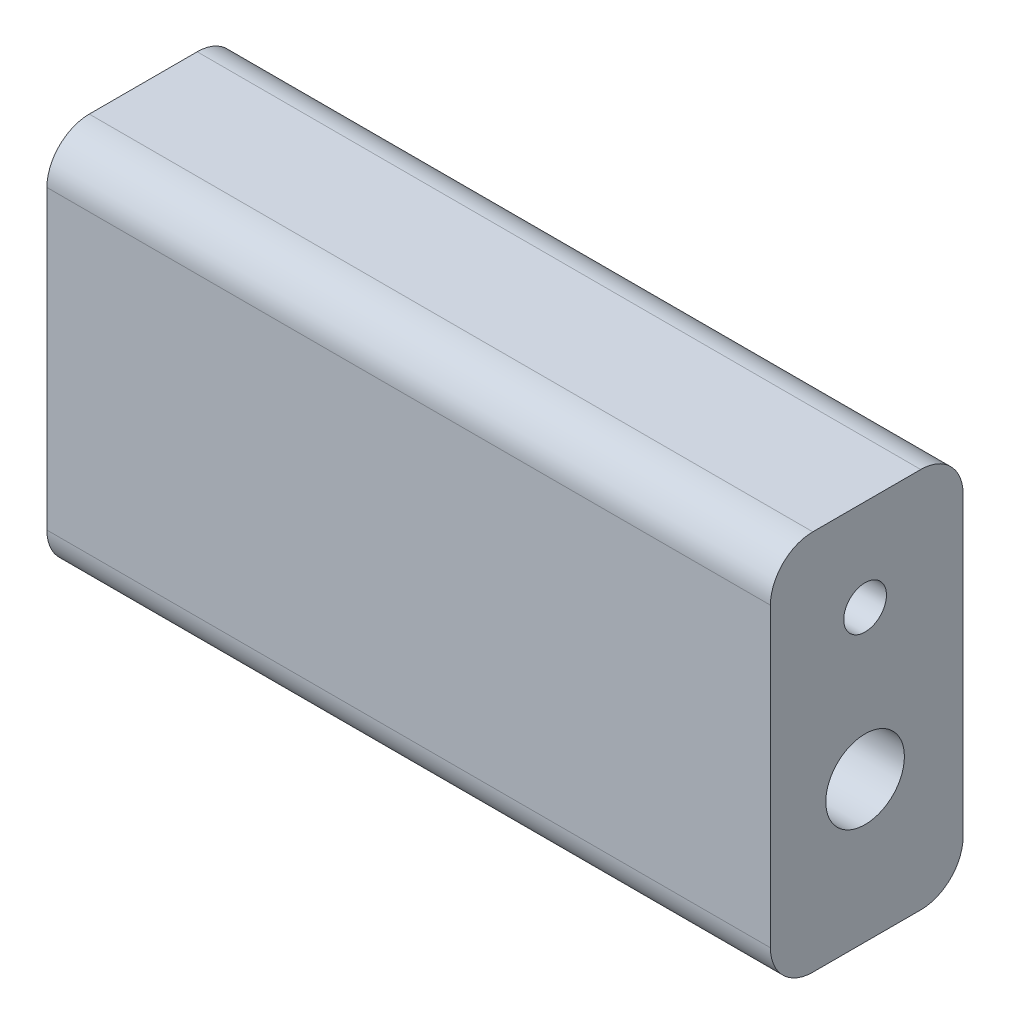
ISO-10303-21;
HEADER;
FILE_DESCRIPTION(('STEP AP214'),'2;1');
FILE_NAME('part.step','',(''),(''),'','','');
FILE_SCHEMA(('AUTOMOTIVE_DESIGN { 1 0 10303 214 1 1 1 1 }'));
ENDSEC;
DATA;
#1=APPLICATION_CONTEXT('core data for automotive mechanical design processes');
#2=APPLICATION_PROTOCOL_DEFINITION('international standard','automotive_design',2000,#1);
#3=PRODUCT_CONTEXT('',#1,'mechanical');
#4=PRODUCT('Part','Part','',(#3));
#5=PRODUCT_RELATED_PRODUCT_CATEGORY('part','',(#4));
#6=PRODUCT_DEFINITION_FORMATION('','',#4);
#7=PRODUCT_DEFINITION_CONTEXT('part definition',#1,'design');
#8=PRODUCT_DEFINITION('design','',#6,#7);
#9=PRODUCT_DEFINITION_SHAPE('','',#8);
#10=(LENGTH_UNIT() NAMED_UNIT(*) SI_UNIT(.MILLI.,.METRE.));
#11=(NAMED_UNIT(*) PLANE_ANGLE_UNIT() SI_UNIT($,.RADIAN.));
#12=(NAMED_UNIT(*) SI_UNIT($,.STERADIAN.) SOLID_ANGLE_UNIT());
#13=UNCERTAINTY_MEASURE_WITH_UNIT(LENGTH_MEASURE(1.E-05),#10,'distance_accuracy_value','');
#14=(GEOMETRIC_REPRESENTATION_CONTEXT(3) GLOBAL_UNCERTAINTY_ASSIGNED_CONTEXT((#13)) GLOBAL_UNIT_ASSIGNED_CONTEXT((#10,
#11,#12)) REPRESENTATION_CONTEXT('',''));
#15=CARTESIAN_POINT('',(0.,0.,0.));
#16=DIRECTION('',(0.,0.,1.));
#17=DIRECTION('',(1.,0.,0.));
#18=AXIS2_PLACEMENT_3D('',#15,#16,#17);
#19=CARTESIAN_POINT('',(21.35,11.255,11.37));
#20=DIRECTION('',(-1.,0.,0.));
#21=DIRECTION('',(0.,0.,1.));
#22=AXIS2_PLACEMENT_3D('',#19,#20,#21);
#23=PLANE('',#22);
#24=CARTESIAN_POINT('',(21.35,5.85204475190497,5.7841050987977));
#25=DIRECTION('',(1.,0.,0.));
#26=DIRECTION('',(0.,0.,-1.));
#27=AXIS2_PLACEMENT_3D('',#24,#25,#26);
#28=CIRCLE('',#27,1.26);
#29=CARTESIAN_POINT('',(21.35,5.85204475190497,4.5241050987977));
#30=VERTEX_POINT('',#29);
#31=EDGE_CURVE('E331',#30,#30,#28,.T.);
#32=ORIENTED_EDGE('',*,*,#31,.F.);
#33=EDGE_LOOP('',(#32));
#34=FACE_BOUND('',#33,.T.);
#35=CARTESIAN_POINT('',(21.35,-2.93168199370076,5.7841050987977));
#36=DIRECTION('',(1.,0.,0.));
#37=DIRECTION('',(0.,0.,-1.));
#38=AXIS2_PLACEMENT_3D('',#35,#36,#37);
#39=CIRCLE('',#38,2.32);
#40=CARTESIAN_POINT('',(21.35,-2.93168199370076,3.4641050987977));
#41=VERTEX_POINT('',#40);
#42=EDGE_CURVE('E340',#41,#41,#39,.T.);
#43=ORIENTED_EDGE('',*,*,#42,.F.);
#44=EDGE_LOOP('',(#43));
#45=FACE_BOUND('',#44,.T.);
#46=DIRECTION('',(0.,1.,0.));
#47=VECTOR('',#46,1.);
#48=CARTESIAN_POINT('',(21.35,11.255,11.37));
#49=LINE('',#48,#47);
#50=CARTESIAN_POINT('',(21.35,-8.755,11.37));
#51=VERTEX_POINT('',#50);
#52=CARTESIAN_POINT('',(21.35,8.755,11.37));
#53=VERTEX_POINT('',#52);
#54=EDGE_CURVE('E134',#51,#53,#49,.T.);
#55=ORIENTED_EDGE('',*,*,#54,.F.);
#56=CARTESIAN_POINT('',(21.35,-8.755,8.87));
#57=DIRECTION('',(-1.,0.,0.));
#58=DIRECTION('',(0.,0.,1.));
#59=AXIS2_PLACEMENT_3D('',#56,#57,#58);
#60=CIRCLE('',#59,2.5);
#61=CARTESIAN_POINT('',(21.35,-11.255,8.87));
#62=VERTEX_POINT('',#61);
#63=EDGE_CURVE('E115',#51,#62,#60,.F.);
#64=ORIENTED_EDGE('',*,*,#63,.T.);
#65=DIRECTION('',(0.,0.,-1.));
#66=VECTOR('',#65,1.);
#67=CARTESIAN_POINT('',(21.35,-11.255,11.37));
#68=LINE('',#67,#66);
#69=CARTESIAN_POINT('',(21.35,-11.255,2.5));
#70=VERTEX_POINT('',#69);
#71=EDGE_CURVE('E144',#62,#70,#68,.T.);
#72=ORIENTED_EDGE('',*,*,#71,.T.);
#73=CARTESIAN_POINT('',(21.35,-8.755,2.5));
#74=DIRECTION('',(-1.,0.,0.));
#75=DIRECTION('',(0.,0.,1.));
#76=AXIS2_PLACEMENT_3D('',#73,#74,#75);
#77=CIRCLE('',#76,2.5);
#78=CARTESIAN_POINT('',(21.35,-8.755,0.));
#79=VERTEX_POINT('',#78);
#80=EDGE_CURVE('E124',#70,#79,#77,.F.);
#81=ORIENTED_EDGE('',*,*,#80,.T.);
#82=DIRECTION('',(0.,1.,0.));
#83=VECTOR('',#82,1.);
#84=CARTESIAN_POINT('',(21.35,11.255,0.));
#85=LINE('',#84,#83);
#86=CARTESIAN_POINT('',(21.35,8.755,0.));
#87=VERTEX_POINT('',#86);
#88=EDGE_CURVE('E146',#79,#87,#85,.T.);
#89=ORIENTED_EDGE('',*,*,#88,.T.);
#90=CARTESIAN_POINT('',(21.35,8.755,2.5));
#91=DIRECTION('',(-1.,0.,0.));
#92=DIRECTION('',(0.,0.,1.));
#93=AXIS2_PLACEMENT_3D('',#90,#91,#92);
#94=CIRCLE('',#93,2.5);
#95=CARTESIAN_POINT('',(21.35,11.255,2.5));
#96=VERTEX_POINT('',#95);
#97=EDGE_CURVE('E172',#87,#96,#94,.F.);
#98=ORIENTED_EDGE('',*,*,#97,.T.);
#99=DIRECTION('',(0.,0.,-1.));
#100=VECTOR('',#99,1.);
#101=CARTESIAN_POINT('',(21.35,11.255,11.37));
#102=LINE('',#101,#100);
#103=CARTESIAN_POINT('',(21.35,11.255,8.87));
#104=VERTEX_POINT('',#103);
#105=EDGE_CURVE('E170',#104,#96,#102,.T.);
#106=ORIENTED_EDGE('',*,*,#105,.F.);
#107=CARTESIAN_POINT('',(21.35,8.755,8.87));
#108=DIRECTION('',(-1.,0.,0.));
#109=DIRECTION('',(0.,0.,1.));
#110=AXIS2_PLACEMENT_3D('',#107,#108,#109);
#111=CIRCLE('',#110,2.5);
#112=EDGE_CURVE('E132',#104,#53,#111,.F.);
#113=ORIENTED_EDGE('',*,*,#112,.T.);
#114=EDGE_LOOP('',(#55,#64,#72,#81,#89,#98,#106,#113));
#115=FACE_BOUND('',#114,.T.);
#116=ADVANCED_FACE('F44',(#34,#45,#115),#23,.F.);
#117=CARTESIAN_POINT('',(-21.35,11.255,11.37));
#118=DIRECTION('',(0.,-1.,0.));
#119=DIRECTION('',(0.,0.,-1.));
#120=AXIS2_PLACEMENT_3D('',#117,#118,#119);
#121=PLANE('',#120);
#122=ORIENTED_EDGE('',*,*,#105,.T.);
#123=DIRECTION('',(-1.,0.,0.));
#124=VECTOR('',#123,1.);
#125=CARTESIAN_POINT('',(-21.35,11.255,2.5));
#126=LINE('',#125,#124);
#127=CARTESIAN_POINT('',(-21.35,11.255,2.5));
#128=VERTEX_POINT('',#127);
#129=EDGE_CURVE('E11',#96,#128,#126,.T.);
#130=ORIENTED_EDGE('',*,*,#129,.T.);
#131=DIRECTION('',(0.,0.,-1.));
#132=VECTOR('',#131,1.);
#133=CARTESIAN_POINT('',(-21.35,11.255,11.37));
#134=LINE('',#133,#132);
#135=CARTESIAN_POINT('',(-21.35,11.255,8.87));
#136=VERTEX_POINT('',#135);
#137=EDGE_CURVE('E163',#136,#128,#134,.T.);
#138=ORIENTED_EDGE('',*,*,#137,.F.);
#139=DIRECTION('',(-1.,0.,0.));
#140=VECTOR('',#139,1.);
#141=CARTESIAN_POINT('',(21.35,11.255,8.87));
#142=LINE('',#141,#140);
#143=EDGE_CURVE('E53',#136,#104,#142,.F.);
#144=ORIENTED_EDGE('',*,*,#143,.T.);
#145=EDGE_LOOP('',(#122,#130,#138,#144));
#146=FACE_BOUND('',#145,.T.);
#147=ADVANCED_FACE('F201',(#146),#121,.F.);
#148=CARTESIAN_POINT('',(-21.35,11.255,11.37));
#149=DIRECTION('',(1.,0.,0.));
#150=DIRECTION('',(0.,0.,-1.));
#151=AXIS2_PLACEMENT_3D('',#148,#149,#150);
#152=PLANE('',#151);
#153=DIRECTION('',(0.,0.,-1.));
#154=VECTOR('',#153,1.);
#155=CARTESIAN_POINT('',(-21.35,-11.255,11.37));
#156=LINE('',#155,#154);
#157=CARTESIAN_POINT('',(-21.35,-11.255,8.87));
#158=VERTEX_POINT('',#157);
#159=CARTESIAN_POINT('',(-21.35,-11.255,2.5));
#160=VERTEX_POINT('',#159);
#161=EDGE_CURVE('E159',#158,#160,#156,.T.);
#162=ORIENTED_EDGE('',*,*,#161,.F.);
#163=CARTESIAN_POINT('',(-21.35,-8.755,8.87));
#164=DIRECTION('',(1.,0.,0.));
#165=DIRECTION('',(0.,0.,-1.));
#166=AXIS2_PLACEMENT_3D('',#163,#164,#165);
#167=CIRCLE('',#166,2.5);
#168=CARTESIAN_POINT('',(-21.35,-8.755,11.37));
#169=VERTEX_POINT('',#168);
#170=EDGE_CURVE('E195',#158,#169,#167,.F.);
#171=ORIENTED_EDGE('',*,*,#170,.T.);
#172=DIRECTION('',(0.,-1.,0.));
#173=VECTOR('',#172,1.);
#174=CARTESIAN_POINT('',(-21.35,11.255,11.37));
#175=LINE('',#174,#173);
#176=CARTESIAN_POINT('',(-21.35,8.755,11.37));
#177=VERTEX_POINT('',#176);
#178=EDGE_CURVE('E135',#177,#169,#175,.T.);
#179=ORIENTED_EDGE('',*,*,#178,.F.);
#180=CARTESIAN_POINT('',(-21.35,8.755,8.87));
#181=DIRECTION('',(1.,0.,0.));
#182=DIRECTION('',(0.,0.,-1.));
#183=AXIS2_PLACEMENT_3D('',#180,#181,#182);
#184=CIRCLE('',#183,2.5);
#185=EDGE_CURVE('E68',#177,#136,#184,.F.);
#186=ORIENTED_EDGE('',*,*,#185,.T.);
#187=ORIENTED_EDGE('',*,*,#137,.T.);
#188=CARTESIAN_POINT('',(-21.35,8.755,2.5));
#189=DIRECTION('',(1.,0.,0.));
#190=DIRECTION('',(0.,0.,-1.));
#191=AXIS2_PLACEMENT_3D('',#188,#189,#190);
#192=CIRCLE('',#191,2.5);
#193=CARTESIAN_POINT('',(-21.35,8.755,0.));
#194=VERTEX_POINT('',#193);
#195=EDGE_CURVE('E64',#128,#194,#192,.F.);
#196=ORIENTED_EDGE('',*,*,#195,.T.);
#197=DIRECTION('',(0.,-1.,0.));
#198=VECTOR('',#197,1.);
#199=CARTESIAN_POINT('',(-21.35,11.255,0.));
#200=LINE('',#199,#198);
#201=CARTESIAN_POINT('',(-21.35,-8.755,0.));
#202=VERTEX_POINT('',#201);
#203=EDGE_CURVE('E143',#194,#202,#200,.T.);
#204=ORIENTED_EDGE('',*,*,#203,.T.);
#205=CARTESIAN_POINT('',(-21.35,-8.755,2.5));
#206=DIRECTION('',(1.,0.,0.));
#207=DIRECTION('',(0.,0.,-1.));
#208=AXIS2_PLACEMENT_3D('',#205,#206,#207);
#209=CIRCLE('',#208,2.5);
#210=EDGE_CURVE('E188',#202,#160,#209,.F.);
#211=ORIENTED_EDGE('',*,*,#210,.T.);
#212=EDGE_LOOP('',(#162,#171,#179,#186,#187,#196,#204,#211));
#213=FACE_BOUND('',#212,.T.);
#214=ADVANCED_FACE('F210',(#213),#152,.F.);
#215=CARTESIAN_POINT('',(-21.35,-11.255,11.37));
#216=DIRECTION('',(0.,1.,0.));
#217=DIRECTION('',(0.,0.,1.));
#218=AXIS2_PLACEMENT_3D('',#215,#216,#217);
#219=PLANE('',#218);
#220=ORIENTED_EDGE('',*,*,#71,.F.);
#221=DIRECTION('',(1.,0.,0.));
#222=VECTOR('',#221,1.);
#223=CARTESIAN_POINT('',(-21.35,-11.255,8.87));
#224=LINE('',#223,#222);
#225=EDGE_CURVE('E116',#62,#158,#224,.F.);
#226=ORIENTED_EDGE('',*,*,#225,.T.);
#227=ORIENTED_EDGE('',*,*,#161,.T.);
#228=DIRECTION('',(1.,0.,0.));
#229=VECTOR('',#228,1.);
#230=CARTESIAN_POINT('',(-21.35,-11.255,2.5));
#231=LINE('',#230,#229);
#232=EDGE_CURVE('E123',#160,#70,#231,.T.);
#233=ORIENTED_EDGE('',*,*,#232,.T.);
#234=EDGE_LOOP('',(#220,#226,#227,#233));
#235=FACE_BOUND('',#234,.T.);
#236=ADVANCED_FACE('F211',(#235),#219,.F.);
#237=CARTESIAN_POINT('',(0.,0.,11.37));
#238=DIRECTION('',(0.,0.,1.));
#239=DIRECTION('',(1.,0.,0.));
#240=AXIS2_PLACEMENT_3D('',#237,#238,#239);
#241=PLANE('',#240);
#242=ORIENTED_EDGE('',*,*,#178,.T.);
#243=DIRECTION('',(1.,0.,0.));
#244=VECTOR('',#243,1.);
#245=CARTESIAN_POINT('',(21.35,-8.755,11.37));
#246=LINE('',#245,#244);
#247=EDGE_CURVE('E119',#169,#51,#246,.T.);
#248=ORIENTED_EDGE('',*,*,#247,.T.);
#249=ORIENTED_EDGE('',*,*,#54,.T.);
#250=DIRECTION('',(-1.,0.,0.));
#251=VECTOR('',#250,1.);
#252=CARTESIAN_POINT('',(-21.35,8.755,11.37));
#253=LINE('',#252,#251);
#254=EDGE_CURVE('E137',#53,#177,#253,.T.);
#255=ORIENTED_EDGE('',*,*,#254,.T.);
#256=EDGE_LOOP('',(#242,#248,#249,#255));
#257=FACE_BOUND('',#256,.T.);
#258=ADVANCED_FACE('F129',(#257),#241,.T.);
#259=CARTESIAN_POINT('',(0.,0.,0.));
#260=DIRECTION('',(0.,0.,1.));
#261=DIRECTION('',(1.,0.,0.));
#262=AXIS2_PLACEMENT_3D('',#259,#260,#261);
#263=PLANE('',#262);
#264=ORIENTED_EDGE('',*,*,#88,.F.);
#265=DIRECTION('',(1.,0.,0.));
#266=VECTOR('',#265,1.);
#267=CARTESIAN_POINT('',(0.,-8.755,0.));
#268=LINE('',#267,#266);
#269=EDGE_CURVE('E196',#79,#202,#268,.F.);
#270=ORIENTED_EDGE('',*,*,#269,.T.);
#271=ORIENTED_EDGE('',*,*,#203,.F.);
#272=DIRECTION('',(-1.,0.,0.));
#273=VECTOR('',#272,1.);
#274=CARTESIAN_POINT('',(0.,8.755,0.));
#275=LINE('',#274,#273);
#276=EDGE_CURVE('E191',#194,#87,#275,.F.);
#277=ORIENTED_EDGE('',*,*,#276,.T.);
#278=EDGE_LOOP('',(#264,#270,#271,#277));
#279=FACE_BOUND('',#278,.T.);
#280=ADVANCED_FACE('F220',(#279),#263,.F.);
#281=CARTESIAN_POINT('',(0.,-8.755,8.87));
#282=DIRECTION('',(-1.,0.,0.));
#283=DIRECTION('',(0.,0.,1.));
#284=AXIS2_PLACEMENT_3D('',#281,#282,#283);
#285=CYLINDRICAL_SURFACE('',#284,2.5);
#286=ORIENTED_EDGE('',*,*,#170,.F.);
#287=ORIENTED_EDGE('',*,*,#225,.F.);
#288=ORIENTED_EDGE('',*,*,#63,.F.);
#289=ORIENTED_EDGE('',*,*,#247,.F.);
#290=EDGE_LOOP('',(#286,#287,#288,#289));
#291=FACE_BOUND('',#290,.T.);
#292=ADVANCED_FACE('F113',(#291),#285,.T.);
#293=CARTESIAN_POINT('',(-21.35,-8.755,2.5));
#294=DIRECTION('',(1.,0.,0.));
#295=DIRECTION('',(0.,0.,-1.));
#296=AXIS2_PLACEMENT_3D('',#293,#294,#295);
#297=CYLINDRICAL_SURFACE('',#296,2.5);
#298=ORIENTED_EDGE('',*,*,#210,.F.);
#299=ORIENTED_EDGE('',*,*,#269,.F.);
#300=ORIENTED_EDGE('',*,*,#80,.F.);
#301=ORIENTED_EDGE('',*,*,#232,.F.);
#302=EDGE_LOOP('',(#298,#299,#300,#301));
#303=FACE_BOUND('',#302,.T.);
#304=ADVANCED_FACE('F213',(#303),#297,.T.);
#305=CARTESIAN_POINT('',(-21.35,8.755,2.5));
#306=DIRECTION('',(-1.,0.,0.));
#307=DIRECTION('',(0.,0.,1.));
#308=AXIS2_PLACEMENT_3D('',#305,#306,#307);
#309=CYLINDRICAL_SURFACE('',#308,2.5);
#310=ORIENTED_EDGE('',*,*,#97,.F.);
#311=ORIENTED_EDGE('',*,*,#276,.F.);
#312=ORIENTED_EDGE('',*,*,#195,.F.);
#313=ORIENTED_EDGE('',*,*,#129,.F.);
#314=EDGE_LOOP('',(#310,#311,#312,#313));
#315=FACE_BOUND('',#314,.T.);
#316=ADVANCED_FACE('F218',(#315),#309,.T.);
#317=CARTESIAN_POINT('',(0.,8.755,8.87));
#318=DIRECTION('',(1.,0.,0.));
#319=DIRECTION('',(0.,0.,-1.));
#320=AXIS2_PLACEMENT_3D('',#317,#318,#319);
#321=CYLINDRICAL_SURFACE('',#320,2.5);
#322=ORIENTED_EDGE('',*,*,#112,.F.);
#323=ORIENTED_EDGE('',*,*,#143,.F.);
#324=ORIENTED_EDGE('',*,*,#185,.F.);
#325=ORIENTED_EDGE('',*,*,#254,.F.);
#326=EDGE_LOOP('',(#322,#323,#324,#325));
#327=FACE_BOUND('',#326,.T.);
#328=ADVANCED_FACE('F50',(#327),#321,.T.);
#329=CARTESIAN_POINT('',(9.34999999999999,-2.93168199370076,5.7841050987977));
#330=DIRECTION('',(1.,0.,0.));
#331=DIRECTION('',(0.,0.,-1.));
#332=AXIS2_PLACEMENT_3D('',#329,#330,#331);
#333=CYLINDRICAL_SURFACE('',#332,2.32);
#334=CARTESIAN_POINT('',(9.34999999999999,-2.93168199370076,5.7841050987977));
#335=DIRECTION('',(1.,0.,0.));
#336=DIRECTION('',(0.,0.,-1.));
#337=AXIS2_PLACEMENT_3D('',#334,#335,#336);
#338=CIRCLE('',#337,2.32);
#339=CARTESIAN_POINT('',(9.34999999999999,-2.93168199370076,3.4641050987977));
#340=VERTEX_POINT('',#339);
#341=EDGE_CURVE('E151',#340,#340,#338,.T.);
#342=ORIENTED_EDGE('',*,*,#341,.F.);
#343=EDGE_LOOP('',(#342));
#344=FACE_BOUND('',#343,.T.);
#345=ORIENTED_EDGE('',*,*,#42,.T.);
#346=EDGE_LOOP('',(#345));
#347=FACE_BOUND('',#346,.T.);
#348=ADVANCED_FACE('F223',(#344,#347),#333,.F.);
#349=CARTESIAN_POINT('',(9.34999999999999,-2.93168199370076,5.7841050987977));
#350=DIRECTION('',(1.,0.,0.));
#351=DIRECTION('',(0.,0.,-1.));
#352=AXIS2_PLACEMENT_3D('',#349,#350,#351);
#353=PLANE('',#352);
#354=ORIENTED_EDGE('',*,*,#341,.T.);
#355=EDGE_LOOP('',(#354));
#356=FACE_BOUND('',#355,.T.);
#357=ADVANCED_FACE('F298',(#356),#353,.T.);
#358=CARTESIAN_POINT('',(9.34999999999999,5.85204475190497,5.7841050987977));
#359=DIRECTION('',(1.,0.,0.));
#360=DIRECTION('',(0.,0.,-1.));
#361=AXIS2_PLACEMENT_3D('',#358,#359,#360);
#362=CYLINDRICAL_SURFACE('',#361,1.26);
#363=CARTESIAN_POINT('',(9.34999999999999,5.85204475190497,5.7841050987977));
#364=DIRECTION('',(1.,0.,0.));
#365=DIRECTION('',(0.,0.,-1.));
#366=AXIS2_PLACEMENT_3D('',#363,#364,#365);
#367=CIRCLE('',#366,1.26);
#368=CARTESIAN_POINT('',(9.34999999999999,5.85204475190497,4.5241050987977));
#369=VERTEX_POINT('',#368);
#370=EDGE_CURVE('E156',#369,#369,#367,.T.);
#371=ORIENTED_EDGE('',*,*,#370,.F.);
#372=EDGE_LOOP('',(#371));
#373=FACE_BOUND('',#372,.T.);
#374=ORIENTED_EDGE('',*,*,#31,.T.);
#375=EDGE_LOOP('',(#374));
#376=FACE_BOUND('',#375,.T.);
#377=ADVANCED_FACE('F310',(#373,#376),#362,.F.);
#378=CARTESIAN_POINT('',(9.34999999999999,5.85204475190497,5.7841050987977));
#379=DIRECTION('',(1.,0.,0.));
#380=DIRECTION('',(0.,0.,-1.));
#381=AXIS2_PLACEMENT_3D('',#378,#379,#380);
#382=PLANE('',#381);
#383=ORIENTED_EDGE('',*,*,#370,.T.);
#384=EDGE_LOOP('',(#383));
#385=FACE_BOUND('',#384,.T.);
#386=ADVANCED_FACE('F318',(#385),#382,.T.);
#387=CLOSED_SHELL('',(#116,#147,#214,#236,#258,#280,#292,#304,#316,#328,#348,#357,#377,#386));
#388=MANIFOLD_SOLID_BREP('B2',#387);
#389=ADVANCED_BREP_SHAPE_REPRESENTATION('',(#18,#388),#14);
#390=SHAPE_DEFINITION_REPRESENTATION(#9,#389);
ENDSEC;
END-ISO-10303-21;
